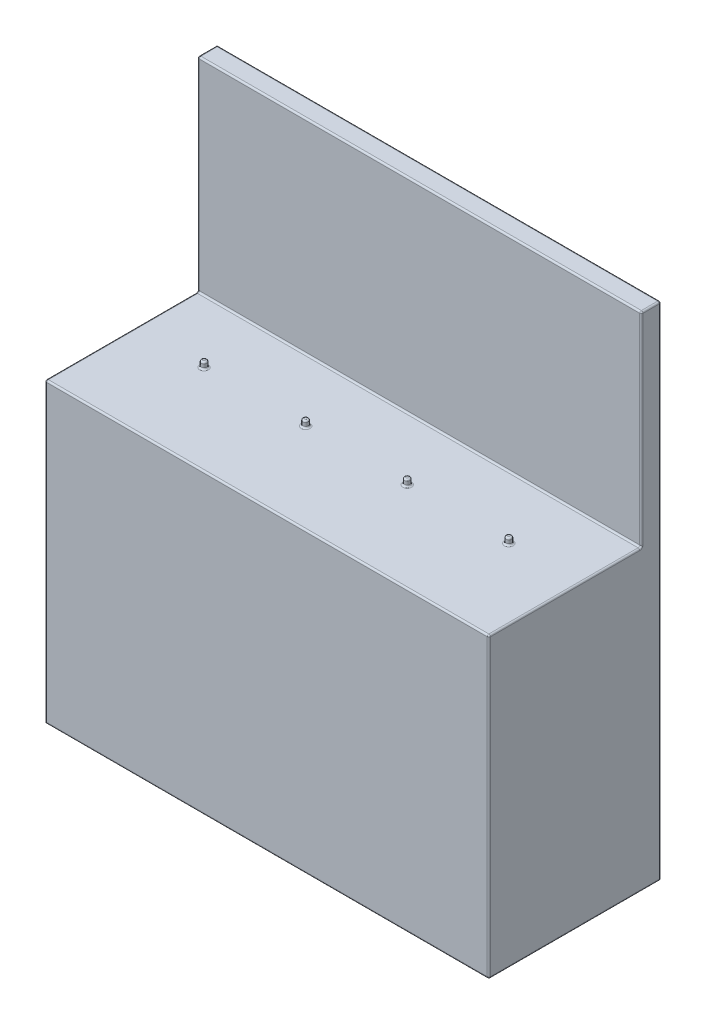
ISO-10303-21;
HEADER;
FILE_DESCRIPTION(('STEP AP214'),'2;1');
FILE_NAME('part.step','',(''),(''),'','','');
FILE_SCHEMA(('AUTOMOTIVE_DESIGN { 1 0 10303 214 1 1 1 1 }'));
ENDSEC;
DATA;
#1=APPLICATION_CONTEXT('core data for automotive mechanical design processes');
#2=APPLICATION_PROTOCOL_DEFINITION('international standard','automotive_design',2000,#1);
#3=PRODUCT_CONTEXT('',#1,'mechanical');
#4=PRODUCT('Part','Part','',(#3));
#5=PRODUCT_RELATED_PRODUCT_CATEGORY('part','',(#4));
#6=PRODUCT_DEFINITION_FORMATION('','',#4);
#7=PRODUCT_DEFINITION_CONTEXT('part definition',#1,'design');
#8=PRODUCT_DEFINITION('design','',#6,#7);
#9=PRODUCT_DEFINITION_SHAPE('','',#8);
#10=(LENGTH_UNIT() NAMED_UNIT(*) SI_UNIT(.MILLI.,.METRE.));
#11=(NAMED_UNIT(*) PLANE_ANGLE_UNIT() SI_UNIT($,.RADIAN.));
#12=(NAMED_UNIT(*) SI_UNIT($,.STERADIAN.) SOLID_ANGLE_UNIT());
#13=UNCERTAINTY_MEASURE_WITH_UNIT(LENGTH_MEASURE(1.E-05),#10,'distance_accuracy_value','');
#14=(GEOMETRIC_REPRESENTATION_CONTEXT(3) GLOBAL_UNCERTAINTY_ASSIGNED_CONTEXT((#13)) GLOBAL_UNIT_ASSIGNED_CONTEXT((#10,
#11,#12)) REPRESENTATION_CONTEXT('',''));
#15=CARTESIAN_POINT('',(0.,0.,0.));
#16=DIRECTION('',(0.,0.,1.));
#17=DIRECTION('',(1.,0.,0.));
#18=AXIS2_PLACEMENT_3D('',#15,#16,#17);
#19=CARTESIAN_POINT('',(0.,908.,-525.));
#20=DIRECTION('',(0.,-1.,0.));
#21=DIRECTION('',(0.,0.,-1.));
#22=AXIS2_PLACEMENT_3D('',#19,#20,#21);
#23=PLANE('',#22);
#24=DIRECTION('',(0.,0.,-1.));
#25=VECTOR('',#24,1.);
#26=CARTESIAN_POINT('',(1349.,908.,-525.));
#27=LINE('',#26,#25);
#28=CARTESIAN_POINT('',(1349.,908.,-5.));
#29=VERTEX_POINT('',#28);
#30=CARTESIAN_POINT('',(1349.,908.,-460.4));
#31=VERTEX_POINT('',#30);
#32=EDGE_CURVE('E230',#29,#31,#27,.T.);
#33=ORIENTED_EDGE('',*,*,#32,.T.);
#34=DIRECTION('',(1.,0.,0.));
#35=VECTOR('',#34,1.);
#36=CARTESIAN_POINT('',(0.,908.,-460.4));
#37=LINE('',#36,#35);
#38=CARTESIAN_POINT('',(5.,908.,-460.4));
#39=VERTEX_POINT('',#38);
#40=EDGE_CURVE('E236',#31,#39,#37,.F.);
#41=ORIENTED_EDGE('',*,*,#40,.T.);
#42=DIRECTION('',(0.,0.,1.));
#43=VECTOR('',#42,1.);
#44=CARTESIAN_POINT('',(5.,908.,-525.));
#45=LINE('',#44,#43);
#46=CARTESIAN_POINT('',(5.,908.,-5.));
#47=VERTEX_POINT('',#46);
#48=EDGE_CURVE('E234',#39,#47,#45,.T.);
#49=ORIENTED_EDGE('',*,*,#48,.T.);
#50=DIRECTION('',(1.,0.,0.));
#51=VECTOR('',#50,1.);
#52=CARTESIAN_POINT('',(0.,908.,-5.));
#53=LINE('',#52,#51);
#54=EDGE_CURVE('E232',#47,#29,#53,.T.);
#55=ORIENTED_EDGE('',*,*,#54,.T.);
#56=EDGE_LOOP('',(#33,#41,#49,#55));
#57=FACE_BOUND('',#56,.T.);
#58=CARTESIAN_POINT('',(210.,908.,-275.));
#59=DIRECTION('',(0.,-1.,0.));
#60=DIRECTION('',(0.,0.,-1.));
#61=AXIS2_PLACEMENT_3D('',#58,#59,#60);
#62=CIRCLE('',#61,13.5);
#63=CARTESIAN_POINT('',(210.,908.,-288.5));
#64=VERTEX_POINT('',#63);
#65=EDGE_CURVE('E227',#64,#64,#62,.T.);
#66=ORIENTED_EDGE('',*,*,#65,.T.);
#67=EDGE_LOOP('',(#66));
#68=FACE_BOUND('',#67,.T.);
#69=CARTESIAN_POINT('',(520.,908.,-275.));
#70=DIRECTION('',(0.,-1.,0.));
#71=DIRECTION('',(0.,0.,-1.));
#72=AXIS2_PLACEMENT_3D('',#69,#70,#71);
#73=CIRCLE('',#72,13.5);
#74=CARTESIAN_POINT('',(520.,908.,-288.5));
#75=VERTEX_POINT('',#74);
#76=EDGE_CURVE('E224',#75,#75,#73,.T.);
#77=ORIENTED_EDGE('',*,*,#76,.T.);
#78=EDGE_LOOP('',(#77));
#79=FACE_BOUND('',#78,.T.);
#80=CARTESIAN_POINT('',(830.,908.,-275.));
#81=DIRECTION('',(0.,-1.,0.));
#82=DIRECTION('',(0.,0.,-1.));
#83=AXIS2_PLACEMENT_3D('',#80,#81,#82);
#84=CIRCLE('',#83,13.5);
#85=CARTESIAN_POINT('',(830.,908.,-288.5));
#86=VERTEX_POINT('',#85);
#87=EDGE_CURVE('E221',#86,#86,#84,.T.);
#88=ORIENTED_EDGE('',*,*,#87,.T.);
#89=EDGE_LOOP('',(#88));
#90=FACE_BOUND('',#89,.T.);
#91=CARTESIAN_POINT('',(1140.,908.,-275.));
#92=DIRECTION('',(0.,-1.,0.));
#93=DIRECTION('',(0.,0.,-1.));
#94=AXIS2_PLACEMENT_3D('',#91,#92,#93);
#95=CIRCLE('',#94,13.5);
#96=CARTESIAN_POINT('',(1140.,908.,-288.5));
#97=VERTEX_POINT('',#96);
#98=EDGE_CURVE('E218',#97,#97,#95,.T.);
#99=ORIENTED_EDGE('',*,*,#98,.T.);
#100=EDGE_LOOP('',(#99));
#101=FACE_BOUND('',#100,.T.);
#102=ADVANCED_FACE('F33',(#57,#68,#79,#90,#101),#23,.F.);
#103=CARTESIAN_POINT('',(0.,908.,0.));
#104=DIRECTION('',(1.,0.,0.));
#105=DIRECTION('',(0.,0.,-1.));
#106=AXIS2_PLACEMENT_3D('',#103,#104,#105);
#107=PLANE('',#106);
#108=DIRECTION('',(0.,-1.,0.));
#109=VECTOR('',#108,1.);
#110=CARTESIAN_POINT('',(0.,908.,-470.4));
#111=LINE('',#110,#109);
#112=CARTESIAN_POINT('',(0.,913.,-470.4));
#113=VERTEX_POINT('',#112);
#114=CARTESIAN_POINT('',(0.,1525.,-470.4));
#115=VERTEX_POINT('',#114);
#116=EDGE_CURVE('E255',#113,#115,#111,.F.);
#117=ORIENTED_EDGE('',*,*,#116,.T.);
#118=DIRECTION('',(0.,0.,1.));
#119=VECTOR('',#118,1.);
#120=CARTESIAN_POINT('',(0.,1525.,-525.));
#121=LINE('',#120,#119);
#122=CARTESIAN_POINT('',(0.,1525.,-525.));
#123=VERTEX_POINT('',#122);
#124=EDGE_CURVE('E166',#115,#123,#121,.F.);
#125=ORIENTED_EDGE('',*,*,#124,.T.);
#126=DIRECTION('',(0.,-1.,0.));
#127=VECTOR('',#126,1.);
#128=CARTESIAN_POINT('',(0.,908.,-525.));
#129=LINE('',#128,#127);
#130=CARTESIAN_POINT('',(0.,0.,-525.));
#131=VERTEX_POINT('',#130);
#132=EDGE_CURVE('E153',#123,#131,#129,.T.);
#133=ORIENTED_EDGE('',*,*,#132,.T.);
#134=DIRECTION('',(0.,0.,1.));
#135=VECTOR('',#134,1.);
#136=CARTESIAN_POINT('',(0.,0.,0.));
#137=LINE('',#136,#135);
#138=CARTESIAN_POINT('',(0.,0.,-5.));
#139=VERTEX_POINT('',#138);
#140=EDGE_CURVE('E158',#131,#139,#137,.T.);
#141=ORIENTED_EDGE('',*,*,#140,.T.);
#142=DIRECTION('',(0.,-1.,0.));
#143=VECTOR('',#142,1.);
#144=CARTESIAN_POINT('',(0.,908.,-5.));
#145=LINE('',#144,#143);
#146=CARTESIAN_POINT('',(0.,903.,-5.));
#147=VERTEX_POINT('',#146);
#148=EDGE_CURVE('E248',#139,#147,#145,.F.);
#149=ORIENTED_EDGE('',*,*,#148,.T.);
#150=DIRECTION('',(0.,0.,1.));
#151=VECTOR('',#150,1.);
#152=CARTESIAN_POINT('',(0.,903.,0.));
#153=LINE('',#152,#151);
#154=CARTESIAN_POINT('',(0.,903.,-460.4));
#155=VERTEX_POINT('',#154);
#156=EDGE_CURVE('E250',#147,#155,#153,.F.);
#157=ORIENTED_EDGE('',*,*,#156,.T.);
#158=CARTESIAN_POINT('',(0.,913.,-460.4));
#159=DIRECTION('',(1.,0.,0.));
#160=DIRECTION('',(0.,0.,-1.));
#161=AXIS2_PLACEMENT_3D('',#158,#159,#160);
#162=CIRCLE('',#161,10.);
#163=EDGE_CURVE('E252',#113,#155,#162,.F.);
#164=ORIENTED_EDGE('',*,*,#163,.F.);
#165=EDGE_LOOP('',(#117,#125,#133,#141,#149,#157,#164));
#166=FACE_BOUND('',#165,.T.);
#167=ADVANCED_FACE('F163',(#166),#107,.F.);
#168=CARTESIAN_POINT('',(0.,908.,0.));
#169=DIRECTION('',(0.,0.,-1.));
#170=DIRECTION('',(-1.,0.,0.));
#171=AXIS2_PLACEMENT_3D('',#168,#169,#170);
#172=PLANE('',#171);
#173=DIRECTION('',(1.,0.,0.));
#174=VECTOR('',#173,1.);
#175=CARTESIAN_POINT('',(1354.,5.,0.));
#176=LINE('',#175,#174);
#177=CARTESIAN_POINT('',(5.,5.,0.));
#178=VERTEX_POINT('',#177);
#179=CARTESIAN_POINT('',(1349.,5.,0.));
#180=VERTEX_POINT('',#179);
#181=EDGE_CURVE('E281',#178,#180,#176,.T.);
#182=ORIENTED_EDGE('',*,*,#181,.T.);
#183=DIRECTION('',(0.,-1.,0.));
#184=VECTOR('',#183,1.);
#185=CARTESIAN_POINT('',(1349.,908.,0.));
#186=LINE('',#185,#184);
#187=CARTESIAN_POINT('',(1349.,903.,0.));
#188=VERTEX_POINT('',#187);
#189=EDGE_CURVE('E56',#180,#188,#186,.F.);
#190=ORIENTED_EDGE('',*,*,#189,.T.);
#191=DIRECTION('',(1.,0.,0.));
#192=VECTOR('',#191,1.);
#193=CARTESIAN_POINT('',(0.,903.,0.));
#194=LINE('',#193,#192);
#195=CARTESIAN_POINT('',(5.,903.,0.));
#196=VERTEX_POINT('',#195);
#197=EDGE_CURVE('E279',#188,#196,#194,.F.);
#198=ORIENTED_EDGE('',*,*,#197,.T.);
#199=DIRECTION('',(0.,-1.,0.));
#200=VECTOR('',#199,1.);
#201=CARTESIAN_POINT('',(5.,908.,0.));
#202=LINE('',#201,#200);
#203=EDGE_CURVE('E277',#196,#178,#202,.T.);
#204=ORIENTED_EDGE('',*,*,#203,.T.);
#205=EDGE_LOOP('',(#182,#190,#198,#204));
#206=FACE_BOUND('',#205,.T.);
#207=ADVANCED_FACE('F387',(#206),#172,.F.);
#208=CARTESIAN_POINT('',(1354.,908.,0.));
#209=DIRECTION('',(-1.,0.,0.));
#210=DIRECTION('',(0.,0.,1.));
#211=AXIS2_PLACEMENT_3D('',#208,#209,#210);
#212=PLANE('',#211);
#213=DIRECTION('',(0.,0.,-1.));
#214=VECTOR('',#213,1.);
#215=CARTESIAN_POINT('',(1354.,5.,-525.));
#216=LINE('',#215,#214);
#217=CARTESIAN_POINT('',(1354.,5.,-5.));
#218=VERTEX_POINT('',#217);
#219=CARTESIAN_POINT('',(1354.,5.,-520.));
#220=VERTEX_POINT('',#219);
#221=EDGE_CURVE('E262',#218,#220,#216,.T.);
#222=ORIENTED_EDGE('',*,*,#221,.T.);
#223=DIRECTION('',(0.,-1.,0.));
#224=VECTOR('',#223,1.);
#225=CARTESIAN_POINT('',(1354.,908.,-520.));
#226=LINE('',#225,#224);
#227=CARTESIAN_POINT('',(1354.,1525.,-520.));
#228=VERTEX_POINT('',#227);
#229=EDGE_CURVE('E272',#220,#228,#226,.F.);
#230=ORIENTED_EDGE('',*,*,#229,.T.);
#231=DIRECTION('',(0.,0.,-1.));
#232=VECTOR('',#231,1.);
#233=CARTESIAN_POINT('',(1354.,1525.,-465.4));
#234=LINE('',#233,#232);
#235=CARTESIAN_POINT('',(1354.,1525.,-470.4));
#236=VERTEX_POINT('',#235);
#237=EDGE_CURVE('E269',#228,#236,#234,.F.);
#238=ORIENTED_EDGE('',*,*,#237,.T.);
#239=DIRECTION('',(0.,-1.,0.));
#240=VECTOR('',#239,1.);
#241=CARTESIAN_POINT('',(1354.,908.,-470.4));
#242=LINE('',#241,#240);
#243=CARTESIAN_POINT('',(1354.,913.,-470.4));
#244=VERTEX_POINT('',#243);
#245=EDGE_CURVE('E267',#236,#244,#242,.T.);
#246=ORIENTED_EDGE('',*,*,#245,.T.);
#247=CARTESIAN_POINT('',(1354.,913.,-460.4));
#248=DIRECTION('',(-1.,0.,0.));
#249=DIRECTION('',(0.,0.,1.));
#250=AXIS2_PLACEMENT_3D('',#247,#248,#249);
#251=CIRCLE('',#250,10.);
#252=CARTESIAN_POINT('',(1354.,903.,-460.4));
#253=VERTEX_POINT('',#252);
#254=EDGE_CURVE('E264',#253,#244,#251,.F.);
#255=ORIENTED_EDGE('',*,*,#254,.F.);
#256=DIRECTION('',(0.,0.,-1.));
#257=VECTOR('',#256,1.);
#258=CARTESIAN_POINT('',(1354.,903.,0.));
#259=LINE('',#258,#257);
#260=CARTESIAN_POINT('',(1354.,903.,-5.));
#261=VERTEX_POINT('',#260);
#262=EDGE_CURVE('E260',#253,#261,#259,.F.);
#263=ORIENTED_EDGE('',*,*,#262,.T.);
#264=DIRECTION('',(0.,-1.,0.));
#265=VECTOR('',#264,1.);
#266=CARTESIAN_POINT('',(1354.,908.,-5.));
#267=LINE('',#266,#265);
#268=EDGE_CURVE('E258',#261,#218,#267,.T.);
#269=ORIENTED_EDGE('',*,*,#268,.T.);
#270=EDGE_LOOP('',(#222,#230,#238,#246,#255,#263,#269));
#271=FACE_BOUND('',#270,.T.);
#272=ADVANCED_FACE('F371',(#271),#212,.F.);
#273=CARTESIAN_POINT('',(0.,908.,-525.));
#274=DIRECTION('',(0.,0.,1.));
#275=DIRECTION('',(1.,0.,0.));
#276=AXIS2_PLACEMENT_3D('',#273,#274,#275);
#277=PLANE('',#276);
#278=ORIENTED_EDGE('',*,*,#132,.F.);
#279=DIRECTION('',(-1.,0.,0.));
#280=VECTOR('',#279,1.);
#281=CARTESIAN_POINT('',(1354.,1525.,-525.));
#282=LINE('',#281,#280);
#283=CARTESIAN_POINT('',(1349.,1525.,-525.));
#284=VERTEX_POINT('',#283);
#285=EDGE_CURVE('E275',#123,#284,#282,.F.);
#286=ORIENTED_EDGE('',*,*,#285,.T.);
#287=DIRECTION('',(0.,-1.,0.));
#288=VECTOR('',#287,1.);
#289=CARTESIAN_POINT('',(1349.,908.,-525.));
#290=LINE('',#289,#288);
#291=CARTESIAN_POINT('',(1349.,0.,-525.));
#292=VERTEX_POINT('',#291);
#293=EDGE_CURVE('E155',#284,#292,#290,.T.);
#294=ORIENTED_EDGE('',*,*,#293,.T.);
#295=DIRECTION('',(-1.,0.,0.));
#296=VECTOR('',#295,1.);
#297=CARTESIAN_POINT('',(0.,0.,-525.));
#298=LINE('',#297,#296);
#299=EDGE_CURVE('E150',#292,#131,#298,.T.);
#300=ORIENTED_EDGE('',*,*,#299,.T.);
#301=EDGE_LOOP('',(#278,#286,#294,#300));
#302=FACE_BOUND('',#301,.T.);
#303=ADVANCED_FACE('F152',(#302),#277,.F.);
#304=CARTESIAN_POINT('',(0.,0.,-525.));
#305=DIRECTION('',(0.,-1.,0.));
#306=DIRECTION('',(0.,0.,-1.));
#307=AXIS2_PLACEMENT_3D('',#304,#305,#306);
#308=PLANE('',#307);
#309=DIRECTION('',(0.,0.,-1.));
#310=VECTOR('',#309,1.);
#311=CARTESIAN_POINT('',(1349.,0.,0.));
#312=LINE('',#311,#310);
#313=CARTESIAN_POINT('',(1349.,0.,-5.));
#314=VERTEX_POINT('',#313);
#315=EDGE_CURVE('E42',#292,#314,#312,.F.);
#316=ORIENTED_EDGE('',*,*,#315,.T.);
#317=DIRECTION('',(1.,0.,0.));
#318=VECTOR('',#317,1.);
#319=CARTESIAN_POINT('',(0.,0.,-5.));
#320=LINE('',#319,#318);
#321=EDGE_CURVE('E11',#314,#139,#320,.F.);
#322=ORIENTED_EDGE('',*,*,#321,.T.);
#323=ORIENTED_EDGE('',*,*,#140,.F.);
#324=ORIENTED_EDGE('',*,*,#299,.F.);
#325=EDGE_LOOP('',(#316,#322,#323,#324));
#326=FACE_BOUND('',#325,.T.);
#327=ADVANCED_FACE('F169',(#326),#308,.T.);
#328=CARTESIAN_POINT('',(0.,1530.,-465.4));
#329=DIRECTION('',(0.,0.,-1.));
#330=DIRECTION('',(-1.,0.,0.));
#331=AXIS2_PLACEMENT_3D('',#328,#329,#330);
#332=PLANE('',#331);
#333=DIRECTION('',(1.,0.,0.));
#334=VECTOR('',#333,1.);
#335=CARTESIAN_POINT('',(1354.,913.,-465.4));
#336=LINE('',#335,#334);
#337=CARTESIAN_POINT('',(5.,913.,-465.4));
#338=VERTEX_POINT('',#337);
#339=CARTESIAN_POINT('',(1349.,913.,-465.4));
#340=VERTEX_POINT('',#339);
#341=EDGE_CURVE('E213',#338,#340,#336,.T.);
#342=ORIENTED_EDGE('',*,*,#341,.T.);
#343=DIRECTION('',(0.,-1.,0.));
#344=VECTOR('',#343,1.);
#345=CARTESIAN_POINT('',(1349.,1530.,-465.4));
#346=LINE('',#345,#344);
#347=CARTESIAN_POINT('',(1349.,1525.,-465.4));
#348=VERTEX_POINT('',#347);
#349=EDGE_CURVE('E216',#340,#348,#346,.F.);
#350=ORIENTED_EDGE('',*,*,#349,.T.);
#351=DIRECTION('',(1.,0.,0.));
#352=VECTOR('',#351,1.);
#353=CARTESIAN_POINT('',(0.,1525.,-465.4));
#354=LINE('',#353,#352);
#355=CARTESIAN_POINT('',(5.,1525.,-465.4));
#356=VERTEX_POINT('',#355);
#357=EDGE_CURVE('E211',#348,#356,#354,.F.);
#358=ORIENTED_EDGE('',*,*,#357,.T.);
#359=DIRECTION('',(0.,-1.,0.));
#360=VECTOR('',#359,1.);
#361=CARTESIAN_POINT('',(5.,1530.,-465.4));
#362=LINE('',#361,#360);
#363=EDGE_CURVE('E209',#356,#338,#362,.T.);
#364=ORIENTED_EDGE('',*,*,#363,.T.);
#365=EDGE_LOOP('',(#342,#350,#358,#364));
#366=FACE_BOUND('',#365,.T.);
#367=ADVANCED_FACE('F422',(#366),#332,.F.);
#368=CARTESIAN_POINT('',(0.,1530.,-465.4));
#369=DIRECTION('',(0.,1.,0.));
#370=DIRECTION('',(0.,0.,1.));
#371=AXIS2_PLACEMENT_3D('',#368,#369,#370);
#372=PLANE('',#371);
#373=DIRECTION('',(-1.,0.,0.));
#374=VECTOR('',#373,1.);
#375=CARTESIAN_POINT('',(0.,1530.,-520.));
#376=LINE('',#375,#374);
#377=CARTESIAN_POINT('',(1349.,1530.,-520.));
#378=VERTEX_POINT('',#377);
#379=CARTESIAN_POINT('',(5.,1530.,-520.));
#380=VERTEX_POINT('',#379);
#381=EDGE_CURVE('E239',#378,#380,#376,.T.);
#382=ORIENTED_EDGE('',*,*,#381,.T.);
#383=DIRECTION('',(0.,0.,1.));
#384=VECTOR('',#383,1.);
#385=CARTESIAN_POINT('',(5.,1530.,-465.4));
#386=LINE('',#385,#384);
#387=CARTESIAN_POINT('',(5.,1530.,-470.4));
#388=VERTEX_POINT('',#387);
#389=EDGE_CURVE('E245',#380,#388,#386,.T.);
#390=ORIENTED_EDGE('',*,*,#389,.T.);
#391=DIRECTION('',(1.,0.,0.));
#392=VECTOR('',#391,1.);
#393=CARTESIAN_POINT('',(1354.,1530.,-470.4));
#394=LINE('',#393,#392);
#395=CARTESIAN_POINT('',(1349.,1530.,-470.4));
#396=VERTEX_POINT('',#395);
#397=EDGE_CURVE('E243',#388,#396,#394,.T.);
#398=ORIENTED_EDGE('',*,*,#397,.T.);
#399=DIRECTION('',(0.,0.,-1.));
#400=VECTOR('',#399,1.);
#401=CARTESIAN_POINT('',(1349.,1530.,-525.));
#402=LINE('',#401,#400);
#403=EDGE_CURVE('E241',#396,#378,#402,.T.);
#404=ORIENTED_EDGE('',*,*,#403,.T.);
#405=EDGE_LOOP('',(#382,#390,#398,#404));
#406=FACE_BOUND('',#405,.T.);
#407=ADVANCED_FACE('F790',(#406),#372,.T.);
#408=CARTESIAN_POINT('',(210.,928.,-275.));
#409=DIRECTION('',(0.,-1.,0.));
#410=DIRECTION('',(0.,0.,-1.));
#411=AXIS2_PLACEMENT_3D('',#408,#409,#410);
#412=CYLINDRICAL_SURFACE('',#411,8.50000000000001);
#413=CARTESIAN_POINT('',(210.,923.,-275.));
#414=DIRECTION('',(0.,1.,0.));
#415=DIRECTION('',(0.,0.,1.));
#416=AXIS2_PLACEMENT_3D('',#413,#414,#415);
#417=CIRCLE('',#416,8.50000000000001);
#418=CARTESIAN_POINT('',(210.,923.,-266.5));
#419=VERTEX_POINT('',#418);
#420=EDGE_CURVE('E206',#419,#419,#417,.F.);
#421=ORIENTED_EDGE('',*,*,#420,.T.);
#422=EDGE_LOOP('',(#421));
#423=FACE_BOUND('',#422,.T.);
#424=CARTESIAN_POINT('',(210.,913.,-275.));
#425=DIRECTION('',(0.,-1.,0.));
#426=DIRECTION('',(0.,0.,-1.));
#427=AXIS2_PLACEMENT_3D('',#424,#425,#426);
#428=CIRCLE('',#427,8.50000000000001);
#429=CARTESIAN_POINT('',(210.,913.,-283.5));
#430=VERTEX_POINT('',#429);
#431=EDGE_CURVE('E203',#430,#430,#428,.F.);
#432=ORIENTED_EDGE('',*,*,#431,.T.);
#433=EDGE_LOOP('',(#432));
#434=FACE_BOUND('',#433,.T.);
#435=ADVANCED_FACE('F781',(#423,#434),#412,.T.);
#436=CARTESIAN_POINT('',(210.,928.,-275.));
#437=DIRECTION('',(0.,1.,0.));
#438=DIRECTION('',(0.,0.,1.));
#439=AXIS2_PLACEMENT_3D('',#436,#437,#438);
#440=PLANE('',#439);
#441=CARTESIAN_POINT('',(210.,928.,-275.));
#442=DIRECTION('',(0.,1.,0.));
#443=DIRECTION('',(0.,0.,1.));
#444=AXIS2_PLACEMENT_3D('',#441,#442,#443);
#445=CIRCLE('',#444,3.50000000000001);
#446=CARTESIAN_POINT('',(210.,928.,-271.5));
#447=VERTEX_POINT('',#446);
#448=EDGE_CURVE('E200',#447,#447,#445,.T.);
#449=ORIENTED_EDGE('',*,*,#448,.T.);
#450=EDGE_LOOP('',(#449));
#451=FACE_BOUND('',#450,.T.);
#452=ADVANCED_FACE('F772',(#451),#440,.T.);
#453=CARTESIAN_POINT('',(520.,928.,-275.));
#454=DIRECTION('',(0.,-1.,0.));
#455=DIRECTION('',(0.,0.,-1.));
#456=AXIS2_PLACEMENT_3D('',#453,#454,#455);
#457=CYLINDRICAL_SURFACE('',#456,8.50000000000001);
#458=CARTESIAN_POINT('',(520.,923.,-275.));
#459=DIRECTION('',(0.,1.,0.));
#460=DIRECTION('',(0.,0.,1.));
#461=AXIS2_PLACEMENT_3D('',#458,#459,#460);
#462=CIRCLE('',#461,8.50000000000001);
#463=CARTESIAN_POINT('',(520.,923.,-266.5));
#464=VERTEX_POINT('',#463);
#465=EDGE_CURVE('E197',#464,#464,#462,.F.);
#466=ORIENTED_EDGE('',*,*,#465,.T.);
#467=EDGE_LOOP('',(#466));
#468=FACE_BOUND('',#467,.T.);
#469=CARTESIAN_POINT('',(520.,913.,-275.));
#470=DIRECTION('',(0.,-1.,0.));
#471=DIRECTION('',(0.,0.,-1.));
#472=AXIS2_PLACEMENT_3D('',#469,#470,#471);
#473=CIRCLE('',#472,8.50000000000001);
#474=CARTESIAN_POINT('',(520.,913.,-283.5));
#475=VERTEX_POINT('',#474);
#476=EDGE_CURVE('E194',#475,#475,#473,.F.);
#477=ORIENTED_EDGE('',*,*,#476,.T.);
#478=EDGE_LOOP('',(#477));
#479=FACE_BOUND('',#478,.T.);
#480=ADVANCED_FACE('F763',(#468,#479),#457,.T.);
#481=CARTESIAN_POINT('',(520.,928.,-275.));
#482=DIRECTION('',(0.,1.,0.));
#483=DIRECTION('',(0.,0.,1.));
#484=AXIS2_PLACEMENT_3D('',#481,#482,#483);
#485=PLANE('',#484);
#486=CARTESIAN_POINT('',(520.,928.,-275.));
#487=DIRECTION('',(0.,1.,0.));
#488=DIRECTION('',(0.,0.,1.));
#489=AXIS2_PLACEMENT_3D('',#486,#487,#488);
#490=CIRCLE('',#489,3.50000000000001);
#491=CARTESIAN_POINT('',(520.,928.,-271.5));
#492=VERTEX_POINT('',#491);
#493=EDGE_CURVE('E191',#492,#492,#490,.T.);
#494=ORIENTED_EDGE('',*,*,#493,.T.);
#495=EDGE_LOOP('',(#494));
#496=FACE_BOUND('',#495,.T.);
#497=ADVANCED_FACE('F754',(#496),#485,.T.);
#498=CARTESIAN_POINT('',(830.,928.,-275.));
#499=DIRECTION('',(0.,-1.,0.));
#500=DIRECTION('',(0.,0.,-1.));
#501=AXIS2_PLACEMENT_3D('',#498,#499,#500);
#502=CYLINDRICAL_SURFACE('',#501,8.50000000000001);
#503=CARTESIAN_POINT('',(830.,923.,-275.));
#504=DIRECTION('',(0.,1.,0.));
#505=DIRECTION('',(0.,0.,1.));
#506=AXIS2_PLACEMENT_3D('',#503,#504,#505);
#507=CIRCLE('',#506,8.50000000000001);
#508=CARTESIAN_POINT('',(830.,923.,-266.5));
#509=VERTEX_POINT('',#508);
#510=EDGE_CURVE('E188',#509,#509,#507,.F.);
#511=ORIENTED_EDGE('',*,*,#510,.T.);
#512=EDGE_LOOP('',(#511));
#513=FACE_BOUND('',#512,.T.);
#514=CARTESIAN_POINT('',(830.,913.,-275.));
#515=DIRECTION('',(0.,-1.,0.));
#516=DIRECTION('',(0.,0.,-1.));
#517=AXIS2_PLACEMENT_3D('',#514,#515,#516);
#518=CIRCLE('',#517,8.50000000000001);
#519=CARTESIAN_POINT('',(830.,913.,-283.5));
#520=VERTEX_POINT('',#519);
#521=EDGE_CURVE('E185',#520,#520,#518,.F.);
#522=ORIENTED_EDGE('',*,*,#521,.T.);
#523=EDGE_LOOP('',(#522));
#524=FACE_BOUND('',#523,.T.);
#525=ADVANCED_FACE('F745',(#513,#524),#502,.T.);
#526=CARTESIAN_POINT('',(830.,928.,-275.));
#527=DIRECTION('',(0.,1.,0.));
#528=DIRECTION('',(0.,0.,1.));
#529=AXIS2_PLACEMENT_3D('',#526,#527,#528);
#530=PLANE('',#529);
#531=CARTESIAN_POINT('',(830.,928.,-275.));
#532=DIRECTION('',(0.,1.,0.));
#533=DIRECTION('',(0.,0.,1.));
#534=AXIS2_PLACEMENT_3D('',#531,#532,#533);
#535=CIRCLE('',#534,3.50000000000001);
#536=CARTESIAN_POINT('',(830.,928.,-271.5));
#537=VERTEX_POINT('',#536);
#538=EDGE_CURVE('E182',#537,#537,#535,.T.);
#539=ORIENTED_EDGE('',*,*,#538,.T.);
#540=EDGE_LOOP('',(#539));
#541=FACE_BOUND('',#540,.T.);
#542=ADVANCED_FACE('F736',(#541),#530,.T.);
#543=CARTESIAN_POINT('',(1140.,928.,-275.));
#544=DIRECTION('',(0.,-1.,0.));
#545=DIRECTION('',(0.,0.,-1.));
#546=AXIS2_PLACEMENT_3D('',#543,#544,#545);
#547=CYLINDRICAL_SURFACE('',#546,8.50000000000001);
#548=CARTESIAN_POINT('',(1140.,923.,-275.));
#549=DIRECTION('',(0.,1.,0.));
#550=DIRECTION('',(0.,0.,1.));
#551=AXIS2_PLACEMENT_3D('',#548,#549,#550);
#552=CIRCLE('',#551,8.50000000000001);
#553=CARTESIAN_POINT('',(1140.,923.,-266.5));
#554=VERTEX_POINT('',#553);
#555=EDGE_CURVE('E179',#554,#554,#552,.F.);
#556=ORIENTED_EDGE('',*,*,#555,.T.);
#557=EDGE_LOOP('',(#556));
#558=FACE_BOUND('',#557,.T.);
#559=CARTESIAN_POINT('',(1140.,913.,-275.));
#560=DIRECTION('',(0.,-1.,0.));
#561=DIRECTION('',(0.,0.,-1.));
#562=AXIS2_PLACEMENT_3D('',#559,#560,#561);
#563=CIRCLE('',#562,8.50000000000001);
#564=CARTESIAN_POINT('',(1140.,913.,-283.5));
#565=VERTEX_POINT('',#564);
#566=EDGE_CURVE('E176',#565,#565,#563,.F.);
#567=ORIENTED_EDGE('',*,*,#566,.T.);
#568=EDGE_LOOP('',(#567));
#569=FACE_BOUND('',#568,.T.);
#570=ADVANCED_FACE('F727',(#558,#569),#547,.T.);
#571=CARTESIAN_POINT('',(1140.,928.,-275.));
#572=DIRECTION('',(0.,1.,0.));
#573=DIRECTION('',(0.,0.,1.));
#574=AXIS2_PLACEMENT_3D('',#571,#572,#573);
#575=PLANE('',#574);
#576=CARTESIAN_POINT('',(1140.,928.,-275.));
#577=DIRECTION('',(0.,1.,0.));
#578=DIRECTION('',(0.,0.,1.));
#579=AXIS2_PLACEMENT_3D('',#576,#577,#578);
#580=CIRCLE('',#579,3.50000000000001);
#581=CARTESIAN_POINT('',(1140.,928.,-271.5));
#582=VERTEX_POINT('',#581);
#583=EDGE_CURVE('E167',#582,#582,#580,.T.);
#584=ORIENTED_EDGE('',*,*,#583,.T.);
#585=EDGE_LOOP('',(#584));
#586=FACE_BOUND('',#585,.T.);
#587=ADVANCED_FACE('F468',(#586),#575,.T.);
#588=CARTESIAN_POINT('',(1140.,923.,-275.));
#589=DIRECTION('',(0.,1.,0.));
#590=DIRECTION('',(0.,0.,1.));
#591=AXIS2_PLACEMENT_3D('',#588,#589,#590);
#592=DEGENERATE_TOROIDAL_SURFACE('',#591,3.50000000000001,5.,.T.);
#593=ORIENTED_EDGE('',*,*,#555,.F.);
#594=EDGE_LOOP('',(#593));
#595=FACE_BOUND('',#594,.T.);
#596=ORIENTED_EDGE('',*,*,#583,.F.);
#597=EDGE_LOOP('',(#596));
#598=FACE_BOUND('',#597,.T.);
#599=ADVANCED_FACE('F464',(#595,#598),#592,.T.);
#600=CARTESIAN_POINT('',(830.,923.,-275.));
#601=DIRECTION('',(0.,1.,0.));
#602=DIRECTION('',(0.,0.,1.));
#603=AXIS2_PLACEMENT_3D('',#600,#601,#602);
#604=DEGENERATE_TOROIDAL_SURFACE('',#603,3.50000000000001,5.,.T.);
#605=ORIENTED_EDGE('',*,*,#510,.F.);
#606=EDGE_LOOP('',(#605));
#607=FACE_BOUND('',#606,.T.);
#608=ORIENTED_EDGE('',*,*,#538,.F.);
#609=EDGE_LOOP('',(#608));
#610=FACE_BOUND('',#609,.T.);
#611=ADVANCED_FACE('F467',(#607,#610),#604,.T.);
#612=CARTESIAN_POINT('',(520.,923.,-275.));
#613=DIRECTION('',(0.,1.,0.));
#614=DIRECTION('',(0.,0.,1.));
#615=AXIS2_PLACEMENT_3D('',#612,#613,#614);
#616=DEGENERATE_TOROIDAL_SURFACE('',#615,3.50000000000001,5.,.T.);
#617=ORIENTED_EDGE('',*,*,#465,.F.);
#618=EDGE_LOOP('',(#617));
#619=FACE_BOUND('',#618,.T.);
#620=ORIENTED_EDGE('',*,*,#493,.F.);
#621=EDGE_LOOP('',(#620));
#622=FACE_BOUND('',#621,.T.);
#623=ADVANCED_FACE('F472',(#619,#622),#616,.T.);
#624=CARTESIAN_POINT('',(210.,923.,-275.));
#625=DIRECTION('',(0.,1.,0.));
#626=DIRECTION('',(0.,0.,1.));
#627=AXIS2_PLACEMENT_3D('',#624,#625,#626);
#628=DEGENERATE_TOROIDAL_SURFACE('',#627,3.50000000000001,5.,.T.);
#629=ORIENTED_EDGE('',*,*,#420,.F.);
#630=EDGE_LOOP('',(#629));
#631=FACE_BOUND('',#630,.T.);
#632=ORIENTED_EDGE('',*,*,#448,.F.);
#633=EDGE_LOOP('',(#632));
#634=FACE_BOUND('',#633,.T.);
#635=ADVANCED_FACE('F476',(#631,#634),#628,.T.);
#636=CARTESIAN_POINT('',(1349.,908.,-520.));
#637=DIRECTION('',(0.,-1.,0.));
#638=DIRECTION('',(0.,0.,-1.));
#639=AXIS2_PLACEMENT_3D('',#636,#637,#638);
#640=CYLINDRICAL_SURFACE('',#639,5.);
#641=CARTESIAN_POINT('',(1349.,1525.,-520.));
#642=DIRECTION('',(0.,1.,0.));
#643=DIRECTION('',(0.,0.,1.));
#644=AXIS2_PLACEMENT_3D('',#641,#642,#643);
#645=CIRCLE('',#644,5.);
#646=EDGE_CURVE('E353',#228,#284,#645,.T.);
#647=ORIENTED_EDGE('',*,*,#646,.F.);
#648=ORIENTED_EDGE('',*,*,#229,.F.);
#649=CARTESIAN_POINT('',(1349.,5.,-520.));
#650=DIRECTION('',(0.,-0.707106781186547,0.707106781186547));
#651=DIRECTION('',(0.,-0.707106781186547,-0.707106781186547));
#652=AXIS2_PLACEMENT_3D('',#649,#650,#651);
#653=ELLIPSE('',#652,7.07106781186547,5.);
#654=EDGE_CURVE('E37',#292,#220,#653,.T.);
#655=ORIENTED_EDGE('',*,*,#654,.F.);
#656=ORIENTED_EDGE('',*,*,#293,.F.);
#657=EDGE_LOOP('',(#647,#648,#655,#656));
#658=FACE_BOUND('',#657,.T.);
#659=ADVANCED_FACE('F376',(#658),#640,.T.);
#660=CARTESIAN_POINT('',(1349.,5.,0.));
#661=DIRECTION('',(0.,0.,1.));
#662=DIRECTION('',(1.,0.,0.));
#663=AXIS2_PLACEMENT_3D('',#660,#661,#662);
#664=CYLINDRICAL_SURFACE('',#663,5.);
#665=ORIENTED_EDGE('',*,*,#654,.T.);
#666=ORIENTED_EDGE('',*,*,#221,.F.);
#667=CARTESIAN_POINT('',(1349.,5.,-5.));
#668=DIRECTION('',(0.,0.,1.));
#669=DIRECTION('',(1.,0.,0.));
#670=AXIS2_PLACEMENT_3D('',#667,#668,#669);
#671=CIRCLE('',#670,5.);
#672=EDGE_CURVE('E350',#314,#218,#671,.T.);
#673=ORIENTED_EDGE('',*,*,#672,.F.);
#674=ORIENTED_EDGE('',*,*,#315,.F.);
#675=EDGE_LOOP('',(#665,#666,#673,#674));
#676=FACE_BOUND('',#675,.T.);
#677=ADVANCED_FACE('F379',(#676),#664,.T.);
#678=CARTESIAN_POINT('',(0.,5.,-5.));
#679=DIRECTION('',(-1.,0.,0.));
#680=DIRECTION('',(0.,0.,1.));
#681=AXIS2_PLACEMENT_3D('',#678,#679,#680);
#682=CYLINDRICAL_SURFACE('',#681,5.);
#683=CARTESIAN_POINT('',(5.,5.,-5.));
#684=DIRECTION('',(0.707106781186547,-0.707106781186547,0.));
#685=DIRECTION('',(-0.707106781186547,-0.707106781186547,0.));
#686=AXIS2_PLACEMENT_3D('',#683,#684,#685);
#687=ELLIPSE('',#686,7.07106781186547,5.);
#688=EDGE_CURVE('E344',#139,#178,#687,.F.);
#689=ORIENTED_EDGE('',*,*,#688,.F.);
#690=ORIENTED_EDGE('',*,*,#321,.F.);
#691=CARTESIAN_POINT('',(1349.,5.,-5.));
#692=DIRECTION('',(1.,0.,0.));
#693=DIRECTION('',(0.,0.,-1.));
#694=AXIS2_PLACEMENT_3D('',#691,#692,#693);
#695=CIRCLE('',#694,5.);
#696=EDGE_CURVE('E347',#180,#314,#695,.T.);
#697=ORIENTED_EDGE('',*,*,#696,.F.);
#698=ORIENTED_EDGE('',*,*,#181,.F.);
#699=EDGE_LOOP('',(#689,#690,#697,#698));
#700=FACE_BOUND('',#699,.T.);
#701=ADVANCED_FACE('F385',(#700),#682,.T.);
#702=CARTESIAN_POINT('',(0.,1525.,-520.));
#703=DIRECTION('',(1.,0.,0.));
#704=DIRECTION('',(0.,0.,-1.));
#705=AXIS2_PLACEMENT_3D('',#702,#703,#704);
#706=CYLINDRICAL_SURFACE('',#705,5.);
#707=CARTESIAN_POINT('',(1349.,1525.,-520.));
#708=DIRECTION('',(1.,0.,0.));
#709=DIRECTION('',(0.,1.,0.));
#710=AXIS2_PLACEMENT_3D('',#707,#708,#709);
#711=CIRCLE('',#710,5.);
#712=EDGE_CURVE('E172',#284,#378,#711,.T.);
#713=ORIENTED_EDGE('',*,*,#712,.F.);
#714=ORIENTED_EDGE('',*,*,#285,.F.);
#715=CARTESIAN_POINT('',(5.,1525.,-520.));
#716=DIRECTION('',(0.707106781186547,0.,-0.707106781186547));
#717=DIRECTION('',(0.707106781186547,0.,0.707106781186547));
#718=AXIS2_PLACEMENT_3D('',#715,#716,#717);
#719=ELLIPSE('',#718,7.07106781186547,5.);
#720=EDGE_CURVE('E342',#380,#123,#719,.F.);
#721=ORIENTED_EDGE('',*,*,#720,.F.);
#722=ORIENTED_EDGE('',*,*,#381,.F.);
#723=EDGE_LOOP('',(#713,#714,#721,#722));
#724=FACE_BOUND('',#723,.T.);
#725=ADVANCED_FACE('F436',(#724),#706,.T.);
#726=CARTESIAN_POINT('',(1349.,1525.,-520.));
#727=DIRECTION('',(0.,0.,1.));
#728=DIRECTION('',(1.,0.,0.));
#729=AXIS2_PLACEMENT_3D('',#726,#727,#728);
#730=SPHERICAL_SURFACE('',#729,5.);
#731=ORIENTED_EDGE('',*,*,#646,.T.);
#732=ORIENTED_EDGE('',*,*,#712,.T.);
#733=CARTESIAN_POINT('',(1349.,1525.,-520.));
#734=DIRECTION('',(0.,0.,-1.));
#735=DIRECTION('',(-1.,0.,0.));
#736=AXIS2_PLACEMENT_3D('',#733,#734,#735);
#737=CIRCLE('',#736,5.);
#738=EDGE_CURVE('E339',#228,#378,#737,.F.);
#739=ORIENTED_EDGE('',*,*,#738,.F.);
#740=EDGE_LOOP('',(#731,#732,#739));
#741=FACE_BOUND('',#740,.T.);
#742=ADVANCED_FACE('F359',(#741),#730,.T.);
#743=CARTESIAN_POINT('',(1349.,5.,-5.));
#744=DIRECTION('',(0.,0.,1.));
#745=DIRECTION('',(1.,0.,0.));
#746=AXIS2_PLACEMENT_3D('',#743,#744,#745);
#747=SPHERICAL_SURFACE('',#746,5.);
#748=ORIENTED_EDGE('',*,*,#696,.T.);
#749=ORIENTED_EDGE('',*,*,#672,.T.);
#750=CARTESIAN_POINT('',(1349.,5.,-5.));
#751=DIRECTION('',(0.,-1.,0.));
#752=DIRECTION('',(0.,0.,-1.));
#753=AXIS2_PLACEMENT_3D('',#750,#751,#752);
#754=CIRCLE('',#753,5.);
#755=EDGE_CURVE('E337',#180,#218,#754,.F.);
#756=ORIENTED_EDGE('',*,*,#755,.F.);
#757=EDGE_LOOP('',(#748,#749,#756));
#758=FACE_BOUND('',#757,.T.);
#759=ADVANCED_FACE('F382',(#758),#747,.T.);
#760=CARTESIAN_POINT('',(5.,908.,-5.));
#761=DIRECTION('',(0.,-1.,0.));
#762=DIRECTION('',(0.,0.,-1.));
#763=AXIS2_PLACEMENT_3D('',#760,#761,#762);
#764=CYLINDRICAL_SURFACE('',#763,5.);
#765=ORIENTED_EDGE('',*,*,#688,.T.);
#766=ORIENTED_EDGE('',*,*,#203,.F.);
#767=CARTESIAN_POINT('',(5.,903.,-5.));
#768=DIRECTION('',(0.,1.,0.));
#769=DIRECTION('',(0.,0.,1.));
#770=AXIS2_PLACEMENT_3D('',#767,#768,#769);
#771=CIRCLE('',#770,5.);
#772=EDGE_CURVE('E331',#147,#196,#771,.T.);
#773=ORIENTED_EDGE('',*,*,#772,.F.);
#774=ORIENTED_EDGE('',*,*,#148,.F.);
#775=EDGE_LOOP('',(#765,#766,#773,#774));
#776=FACE_BOUND('',#775,.T.);
#777=ADVANCED_FACE('F393',(#776),#764,.T.);
#778=CARTESIAN_POINT('',(5.,1525.,-465.4));
#779=DIRECTION('',(0.,0.,-1.));
#780=DIRECTION('',(-1.,0.,0.));
#781=AXIS2_PLACEMENT_3D('',#778,#779,#780);
#782=CYLINDRICAL_SURFACE('',#781,5.);
#783=ORIENTED_EDGE('',*,*,#720,.T.);
#784=ORIENTED_EDGE('',*,*,#124,.F.);
#785=CARTESIAN_POINT('',(5.,1525.,-470.4));
#786=DIRECTION('',(0.,0.,1.));
#787=DIRECTION('',(1.,0.,0.));
#788=AXIS2_PLACEMENT_3D('',#785,#786,#787);
#789=CIRCLE('',#788,5.);
#790=EDGE_CURVE('E328',#388,#115,#789,.T.);
#791=ORIENTED_EDGE('',*,*,#790,.F.);
#792=ORIENTED_EDGE('',*,*,#389,.F.);
#793=EDGE_LOOP('',(#783,#784,#791,#792));
#794=FACE_BOUND('',#793,.T.);
#795=ADVANCED_FACE('F434',(#794),#782,.T.);
#796=CARTESIAN_POINT('',(0.,1525.,-470.4));
#797=DIRECTION('',(-1.,0.,0.));
#798=DIRECTION('',(0.,0.,1.));
#799=AXIS2_PLACEMENT_3D('',#796,#797,#798);
#800=CYLINDRICAL_SURFACE('',#799,5.);
#801=CARTESIAN_POINT('',(1349.,1525.,-470.4));
#802=DIRECTION('',(1.,0.,0.));
#803=DIRECTION('',(0.,0.,-1.));
#804=AXIS2_PLACEMENT_3D('',#801,#802,#803);
#805=CIRCLE('',#804,5.);
#806=EDGE_CURVE('E323',#396,#348,#805,.T.);
#807=ORIENTED_EDGE('',*,*,#806,.F.);
#808=ORIENTED_EDGE('',*,*,#397,.F.);
#809=CARTESIAN_POINT('',(5.,1525.,-470.4));
#810=DIRECTION('',(-1.,0.,0.));
#811=DIRECTION('',(0.,0.,1.));
#812=AXIS2_PLACEMENT_3D('',#809,#810,#811);
#813=CIRCLE('',#812,5.);
#814=EDGE_CURVE('E326',#356,#388,#813,.T.);
#815=ORIENTED_EDGE('',*,*,#814,.F.);
#816=ORIENTED_EDGE('',*,*,#357,.F.);
#817=EDGE_LOOP('',(#807,#808,#815,#816));
#818=FACE_BOUND('',#817,.T.);
#819=ADVANCED_FACE('F428',(#818),#800,.T.);
#820=CARTESIAN_POINT('',(1349.,1525.,-465.4));
#821=DIRECTION('',(0.,0.,1.));
#822=DIRECTION('',(1.,0.,0.));
#823=AXIS2_PLACEMENT_3D('',#820,#821,#822);
#824=CYLINDRICAL_SURFACE('',#823,5.);
#825=ORIENTED_EDGE('',*,*,#738,.T.);
#826=ORIENTED_EDGE('',*,*,#403,.F.);
#827=CARTESIAN_POINT('',(1349.,1525.,-470.4));
#828=DIRECTION('',(0.,0.,1.));
#829=DIRECTION('',(1.,0.,0.));
#830=AXIS2_PLACEMENT_3D('',#827,#828,#829);
#831=CIRCLE('',#830,5.);
#832=EDGE_CURVE('E320',#236,#396,#831,.T.);
#833=ORIENTED_EDGE('',*,*,#832,.F.);
#834=ORIENTED_EDGE('',*,*,#237,.F.);
#835=EDGE_LOOP('',(#825,#826,#833,#834));
#836=FACE_BOUND('',#835,.T.);
#837=ADVANCED_FACE('F367',(#836),#824,.T.);
#838=CARTESIAN_POINT('',(1349.,908.,-5.));
#839=DIRECTION('',(0.,-1.,0.));
#840=DIRECTION('',(0.,0.,-1.));
#841=AXIS2_PLACEMENT_3D('',#838,#839,#840);
#842=CYLINDRICAL_SURFACE('',#841,5.);
#843=ORIENTED_EDGE('',*,*,#755,.T.);
#844=ORIENTED_EDGE('',*,*,#268,.F.);
#845=CARTESIAN_POINT('',(1349.,903.,-5.));
#846=DIRECTION('',(0.,1.,0.));
#847=DIRECTION('',(0.,0.,1.));
#848=AXIS2_PLACEMENT_3D('',#845,#846,#847);
#849=CIRCLE('',#848,5.);
#850=EDGE_CURVE('E317',#188,#261,#849,.T.);
#851=ORIENTED_EDGE('',*,*,#850,.F.);
#852=ORIENTED_EDGE('',*,*,#189,.F.);
#853=EDGE_LOOP('',(#843,#844,#851,#852));
#854=FACE_BOUND('',#853,.T.);
#855=ADVANCED_FACE('F516',(#854),#842,.T.);
#856=CARTESIAN_POINT('',(0.,903.,-5.));
#857=DIRECTION('',(1.,0.,0.));
#858=DIRECTION('',(0.,0.,-1.));
#859=AXIS2_PLACEMENT_3D('',#856,#857,#858);
#860=CYLINDRICAL_SURFACE('',#859,5.);
#861=CARTESIAN_POINT('',(5.,903.,-5.));
#862=DIRECTION('',(-1.,0.,0.));
#863=DIRECTION('',(0.,-1.,0.));
#864=AXIS2_PLACEMENT_3D('',#861,#862,#863);
#865=CIRCLE('',#864,5.);
#866=EDGE_CURVE('E334',#196,#47,#865,.T.);
#867=ORIENTED_EDGE('',*,*,#866,.F.);
#868=ORIENTED_EDGE('',*,*,#197,.F.);
#869=CARTESIAN_POINT('',(1349.,903.,-5.));
#870=DIRECTION('',(1.,0.,0.));
#871=DIRECTION('',(0.,0.,-1.));
#872=AXIS2_PLACEMENT_3D('',#869,#870,#871);
#873=CIRCLE('',#872,5.);
#874=EDGE_CURVE('E314',#29,#188,#873,.T.);
#875=ORIENTED_EDGE('',*,*,#874,.F.);
#876=ORIENTED_EDGE('',*,*,#54,.F.);
#877=EDGE_LOOP('',(#867,#868,#875,#876));
#878=FACE_BOUND('',#877,.T.);
#879=ADVANCED_FACE('F398',(#878),#860,.T.);
#880=CARTESIAN_POINT('',(5.,903.,-5.));
#881=DIRECTION('',(0.,0.,1.));
#882=DIRECTION('',(1.,0.,0.));
#883=AXIS2_PLACEMENT_3D('',#880,#881,#882);
#884=SPHERICAL_SURFACE('',#883,5.);
#885=ORIENTED_EDGE('',*,*,#772,.T.);
#886=ORIENTED_EDGE('',*,*,#866,.T.);
#887=CARTESIAN_POINT('',(5.,903.,-5.));
#888=DIRECTION('',(0.,0.,1.));
#889=DIRECTION('',(1.,0.,0.));
#890=AXIS2_PLACEMENT_3D('',#887,#888,#889);
#891=CIRCLE('',#890,5.);
#892=EDGE_CURVE('E311',#147,#47,#891,.F.);
#893=ORIENTED_EDGE('',*,*,#892,.F.);
#894=EDGE_LOOP('',(#885,#886,#893));
#895=FACE_BOUND('',#894,.T.);
#896=ADVANCED_FACE('F401',(#895),#884,.T.);
#897=CARTESIAN_POINT('',(5.,1525.,-470.4));
#898=DIRECTION('',(0.,0.,1.));
#899=DIRECTION('',(1.,0.,0.));
#900=AXIS2_PLACEMENT_3D('',#897,#898,#899);
#901=SPHERICAL_SURFACE('',#900,5.);
#902=ORIENTED_EDGE('',*,*,#814,.T.);
#903=ORIENTED_EDGE('',*,*,#790,.T.);
#904=CARTESIAN_POINT('',(5.,1525.,-470.4));
#905=DIRECTION('',(0.,1.,0.));
#906=DIRECTION('',(0.,0.,1.));
#907=AXIS2_PLACEMENT_3D('',#904,#905,#906);
#908=CIRCLE('',#907,5.);
#909=EDGE_CURVE('E308',#356,#115,#908,.F.);
#910=ORIENTED_EDGE('',*,*,#909,.F.);
#911=EDGE_LOOP('',(#902,#903,#910));
#912=FACE_BOUND('',#911,.T.);
#913=ADVANCED_FACE('F431',(#912),#901,.T.);
#914=CARTESIAN_POINT('',(1349.,1525.,-470.4));
#915=DIRECTION('',(0.,0.,1.));
#916=DIRECTION('',(1.,0.,0.));
#917=AXIS2_PLACEMENT_3D('',#914,#915,#916);
#918=SPHERICAL_SURFACE('',#917,5.);
#919=ORIENTED_EDGE('',*,*,#832,.T.);
#920=ORIENTED_EDGE('',*,*,#806,.T.);
#921=CARTESIAN_POINT('',(1349.,1525.,-470.4));
#922=DIRECTION('',(0.,1.,0.));
#923=DIRECTION('',(0.,0.,1.));
#924=AXIS2_PLACEMENT_3D('',#921,#922,#923);
#925=CIRCLE('',#924,5.);
#926=EDGE_CURVE('E305',#236,#348,#925,.F.);
#927=ORIENTED_EDGE('',*,*,#926,.F.);
#928=EDGE_LOOP('',(#919,#920,#927));
#929=FACE_BOUND('',#928,.T.);
#930=ADVANCED_FACE('F505',(#929),#918,.T.);
#931=CARTESIAN_POINT('',(1349.,903.,-5.));
#932=DIRECTION('',(0.,0.,1.));
#933=DIRECTION('',(1.,0.,0.));
#934=AXIS2_PLACEMENT_3D('',#931,#932,#933);
#935=SPHERICAL_SURFACE('',#934,5.);
#936=ORIENTED_EDGE('',*,*,#874,.T.);
#937=ORIENTED_EDGE('',*,*,#850,.T.);
#938=CARTESIAN_POINT('',(1349.,903.,-5.));
#939=DIRECTION('',(0.,0.,1.));
#940=DIRECTION('',(0.,-1.,0.));
#941=AXIS2_PLACEMENT_3D('',#938,#939,#940);
#942=CIRCLE('',#941,5.);
#943=EDGE_CURVE('E302',#29,#261,#942,.F.);
#944=ORIENTED_EDGE('',*,*,#943,.F.);
#945=EDGE_LOOP('',(#936,#937,#944));
#946=FACE_BOUND('',#945,.T.);
#947=ADVANCED_FACE('F502',(#946),#935,.T.);
#948=CARTESIAN_POINT('',(5.,903.,-525.));
#949=DIRECTION('',(0.,0.,1.));
#950=DIRECTION('',(1.,0.,0.));
#951=AXIS2_PLACEMENT_3D('',#948,#949,#950);
#952=CYLINDRICAL_SURFACE('',#951,5.);
#953=ORIENTED_EDGE('',*,*,#892,.T.);
#954=ORIENTED_EDGE('',*,*,#48,.F.);
#955=CARTESIAN_POINT('',(5.,903.,-460.4));
#956=DIRECTION('',(0.,0.,-1.));
#957=DIRECTION('',(-1.,0.,0.));
#958=AXIS2_PLACEMENT_3D('',#955,#956,#957);
#959=CIRCLE('',#958,5.);
#960=EDGE_CURVE('E299',#155,#39,#959,.T.);
#961=ORIENTED_EDGE('',*,*,#960,.F.);
#962=ORIENTED_EDGE('',*,*,#156,.F.);
#963=EDGE_LOOP('',(#953,#954,#961,#962));
#964=FACE_BOUND('',#963,.T.);
#965=ADVANCED_FACE('F406',(#964),#952,.T.);
#966=CARTESIAN_POINT('',(5.,1530.,-470.4));
#967=DIRECTION('',(0.,-1.,0.));
#968=DIRECTION('',(0.,0.,-1.));
#969=AXIS2_PLACEMENT_3D('',#966,#967,#968);
#970=CYLINDRICAL_SURFACE('',#969,5.);
#971=ORIENTED_EDGE('',*,*,#909,.T.);
#972=ORIENTED_EDGE('',*,*,#116,.F.);
#973=CARTESIAN_POINT('',(5.,913.,-470.4));
#974=DIRECTION('',(0.,-1.,0.));
#975=DIRECTION('',(0.,0.,-1.));
#976=AXIS2_PLACEMENT_3D('',#973,#974,#975);
#977=CIRCLE('',#976,5.);
#978=EDGE_CURVE('E296',#338,#113,#977,.T.);
#979=ORIENTED_EDGE('',*,*,#978,.F.);
#980=ORIENTED_EDGE('',*,*,#363,.F.);
#981=EDGE_LOOP('',(#971,#972,#979,#980));
#982=FACE_BOUND('',#981,.T.);
#983=ADVANCED_FACE('F411',(#982),#970,.T.);
#984=CARTESIAN_POINT('',(1349.,908.,-470.4));
#985=DIRECTION('',(0.,-1.,0.));
#986=DIRECTION('',(0.,0.,-1.));
#987=AXIS2_PLACEMENT_3D('',#984,#985,#986);
#988=CYLINDRICAL_SURFACE('',#987,5.);
#989=ORIENTED_EDGE('',*,*,#926,.T.);
#990=ORIENTED_EDGE('',*,*,#349,.F.);
#991=CARTESIAN_POINT('',(1349.,913.,-470.4));
#992=DIRECTION('',(0.,-1.,0.));
#993=DIRECTION('',(0.,0.,-1.));
#994=AXIS2_PLACEMENT_3D('',#991,#992,#993);
#995=CIRCLE('',#994,5.);
#996=EDGE_CURVE('E293',#244,#340,#995,.T.);
#997=ORIENTED_EDGE('',*,*,#996,.F.);
#998=ORIENTED_EDGE('',*,*,#245,.F.);
#999=EDGE_LOOP('',(#989,#990,#997,#998));
#1000=FACE_BOUND('',#999,.T.);
#1001=ADVANCED_FACE('F493',(#1000),#988,.T.);
#1002=CARTESIAN_POINT('',(1349.,903.,-525.));
#1003=DIRECTION('',(0.,0.,-1.));
#1004=DIRECTION('',(-1.,0.,0.));
#1005=AXIS2_PLACEMENT_3D('',#1002,#1003,#1004);
#1006=CYLINDRICAL_SURFACE('',#1005,5.);
#1007=ORIENTED_EDGE('',*,*,#943,.T.);
#1008=ORIENTED_EDGE('',*,*,#262,.F.);
#1009=CARTESIAN_POINT('',(1349.,903.,-460.4));
#1010=DIRECTION('',(0.,0.,-1.));
#1011=DIRECTION('',(-1.,0.,0.));
#1012=AXIS2_PLACEMENT_3D('',#1009,#1010,#1011);
#1013=CIRCLE('',#1012,5.);
#1014=EDGE_CURVE('E290',#31,#253,#1013,.T.);
#1015=ORIENTED_EDGE('',*,*,#1014,.F.);
#1016=ORIENTED_EDGE('',*,*,#32,.F.);
#1017=EDGE_LOOP('',(#1007,#1008,#1015,#1016));
#1018=FACE_BOUND('',#1017,.T.);
#1019=ADVANCED_FACE('F490',(#1018),#1006,.T.);
#1020=CARTESIAN_POINT('',(5.,913.,-460.4));
#1021=DIRECTION('',(1.,0.,0.));
#1022=DIRECTION('',(0.,0.,-1.));
#1023=AXIS2_PLACEMENT_3D('',#1020,#1021,#1022);
#1024=TOROIDAL_SURFACE('',#1023,10.,5.);
#1025=ORIENTED_EDGE('',*,*,#163,.T.);
#1026=ORIENTED_EDGE('',*,*,#960,.T.);
#1027=CARTESIAN_POINT('',(5.,913.,-460.4));
#1028=DIRECTION('',(1.,0.,0.));
#1029=DIRECTION('',(0.,0.,-1.));
#1030=AXIS2_PLACEMENT_3D('',#1027,#1028,#1029);
#1031=CIRCLE('',#1030,5.);
#1032=EDGE_CURVE('E288',#338,#39,#1031,.F.);
#1033=ORIENTED_EDGE('',*,*,#1032,.F.);
#1034=ORIENTED_EDGE('',*,*,#978,.T.);
#1035=EDGE_LOOP('',(#1025,#1026,#1033,#1034));
#1036=FACE_BOUND('',#1035,.T.);
#1037=ADVANCED_FACE('F415',(#1036),#1024,.T.);
#1038=CARTESIAN_POINT('',(1349.,913.,-460.4));
#1039=DIRECTION('',(-1.,0.,0.));
#1040=DIRECTION('',(0.,0.,1.));
#1041=AXIS2_PLACEMENT_3D('',#1038,#1039,#1040);
#1042=TOROIDAL_SURFACE('',#1041,10.,5.);
#1043=ORIENTED_EDGE('',*,*,#254,.T.);
#1044=ORIENTED_EDGE('',*,*,#996,.T.);
#1045=CARTESIAN_POINT('',(1349.,913.,-460.4));
#1046=DIRECTION('',(-1.,0.,0.));
#1047=DIRECTION('',(0.,0.,1.));
#1048=AXIS2_PLACEMENT_3D('',#1045,#1046,#1047);
#1049=CIRCLE('',#1048,5.);
#1050=EDGE_CURVE('E286',#31,#340,#1049,.F.);
#1051=ORIENTED_EDGE('',*,*,#1050,.F.);
#1052=ORIENTED_EDGE('',*,*,#1014,.T.);
#1053=EDGE_LOOP('',(#1043,#1044,#1051,#1052));
#1054=FACE_BOUND('',#1053,.T.);
#1055=ADVANCED_FACE('F484',(#1054),#1042,.T.);
#1056=CARTESIAN_POINT('',(0.,913.,-460.4));
#1057=DIRECTION('',(-1.,0.,0.));
#1058=DIRECTION('',(0.,0.,1.));
#1059=AXIS2_PLACEMENT_3D('',#1056,#1057,#1058);
#1060=CYLINDRICAL_SURFACE('',#1059,5.);
#1061=ORIENTED_EDGE('',*,*,#1032,.T.);
#1062=ORIENTED_EDGE('',*,*,#40,.F.);
#1063=ORIENTED_EDGE('',*,*,#1050,.T.);
#1064=ORIENTED_EDGE('',*,*,#341,.F.);
#1065=EDGE_LOOP('',(#1061,#1062,#1063,#1064));
#1066=FACE_BOUND('',#1065,.T.);
#1067=ADVANCED_FACE('F419',(#1066),#1060,.F.);
#1068=CARTESIAN_POINT('',(210.,913.,-275.));
#1069=DIRECTION('',(0.,-1.,0.));
#1070=DIRECTION('',(0.,0.,-1.));
#1071=AXIS2_PLACEMENT_3D('',#1068,#1069,#1070);
#1072=TOROIDAL_SURFACE('',#1071,13.5,5.);
#1073=ORIENTED_EDGE('',*,*,#65,.F.);
#1074=EDGE_LOOP('',(#1073));
#1075=FACE_BOUND('',#1074,.T.);
#1076=ORIENTED_EDGE('',*,*,#431,.F.);
#1077=EDGE_LOOP('',(#1076));
#1078=FACE_BOUND('',#1077,.T.);
#1079=ADVANCED_FACE('F483',(#1075,#1078),#1072,.F.);
#1080=CARTESIAN_POINT('',(520.,913.,-275.));
#1081=DIRECTION('',(0.,-1.,0.));
#1082=DIRECTION('',(0.,0.,-1.));
#1083=AXIS2_PLACEMENT_3D('',#1080,#1081,#1082);
#1084=TOROIDAL_SURFACE('',#1083,13.5,5.);
#1085=ORIENTED_EDGE('',*,*,#76,.F.);
#1086=EDGE_LOOP('',(#1085));
#1087=FACE_BOUND('',#1086,.T.);
#1088=ORIENTED_EDGE('',*,*,#476,.F.);
#1089=EDGE_LOOP('',(#1088));
#1090=FACE_BOUND('',#1089,.T.);
#1091=ADVANCED_FACE('F606',(#1087,#1090),#1084,.F.);
#1092=CARTESIAN_POINT('',(830.,913.,-275.));
#1093=DIRECTION('',(0.,-1.,0.));
#1094=DIRECTION('',(0.,0.,-1.));
#1095=AXIS2_PLACEMENT_3D('',#1092,#1093,#1094);
#1096=TOROIDAL_SURFACE('',#1095,13.5,5.);
#1097=ORIENTED_EDGE('',*,*,#87,.F.);
#1098=EDGE_LOOP('',(#1097));
#1099=FACE_BOUND('',#1098,.T.);
#1100=ORIENTED_EDGE('',*,*,#521,.F.);
#1101=EDGE_LOOP('',(#1100));
#1102=FACE_BOUND('',#1101,.T.);
#1103=ADVANCED_FACE('F614',(#1099,#1102),#1096,.F.);
#1104=CARTESIAN_POINT('',(1140.,913.,-275.));
#1105=DIRECTION('',(0.,-1.,0.));
#1106=DIRECTION('',(0.,0.,-1.));
#1107=AXIS2_PLACEMENT_3D('',#1104,#1105,#1106);
#1108=TOROIDAL_SURFACE('',#1107,13.5,5.);
#1109=ORIENTED_EDGE('',*,*,#98,.F.);
#1110=EDGE_LOOP('',(#1109));
#1111=FACE_BOUND('',#1110,.T.);
#1112=ORIENTED_EDGE('',*,*,#566,.F.);
#1113=EDGE_LOOP('',(#1112));
#1114=FACE_BOUND('',#1113,.T.);
#1115=ADVANCED_FACE('F35',(#1111,#1114),#1108,.F.);
#1116=CLOSED_SHELL('',(#102,#167,#207,#272,#303,#327,#367,#407,#435,#452,#480,#497,#525,#542,
#570,#587,#599,#611,#623,#635,#659,#677,#701,#725,#742,#759,#777,#795,#819,#837,#855,#879,#896,
#913,#930,#947,#965,#983,#1001,#1019,#1037,#1055,#1067,#1079,#1091,#1103,#1115));
#1117=MANIFOLD_SOLID_BREP('B2',#1116);
#1118=ADVANCED_BREP_SHAPE_REPRESENTATION('',(#18,#1117),#14);
#1119=SHAPE_DEFINITION_REPRESENTATION(#9,#1118);
ENDSEC;
END-ISO-10303-21;
